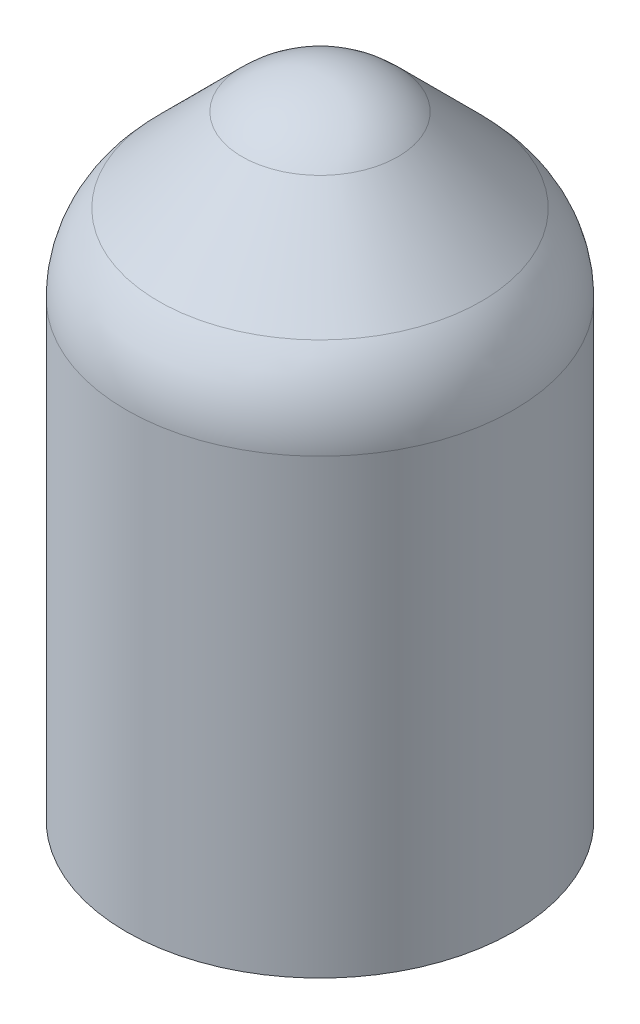
ISO-10303-21;
HEADER;
FILE_DESCRIPTION(('STEP AP214'),'2;1');
FILE_NAME('part.step','',(''),(''),'','','');
FILE_SCHEMA(('AUTOMOTIVE_DESIGN { 1 0 10303 214 1 1 1 1 }'));
ENDSEC;
DATA;
#1=APPLICATION_CONTEXT('core data for automotive mechanical design processes');
#2=APPLICATION_PROTOCOL_DEFINITION('international standard','automotive_design',2000,#1);
#3=PRODUCT_CONTEXT('',#1,'mechanical');
#4=PRODUCT('Part','Part','',(#3));
#5=PRODUCT_RELATED_PRODUCT_CATEGORY('part','',(#4));
#6=PRODUCT_DEFINITION_FORMATION('','',#4);
#7=PRODUCT_DEFINITION_CONTEXT('part definition',#1,'design');
#8=PRODUCT_DEFINITION('design','',#6,#7);
#9=PRODUCT_DEFINITION_SHAPE('','',#8);
#10=(LENGTH_UNIT() NAMED_UNIT(*) SI_UNIT(.MILLI.,.METRE.));
#11=(NAMED_UNIT(*) PLANE_ANGLE_UNIT() SI_UNIT($,.RADIAN.));
#12=(NAMED_UNIT(*) SI_UNIT($,.STERADIAN.) SOLID_ANGLE_UNIT());
#13=UNCERTAINTY_MEASURE_WITH_UNIT(LENGTH_MEASURE(1.E-05),#10,'distance_accuracy_value','');
#14=(GEOMETRIC_REPRESENTATION_CONTEXT(3) GLOBAL_UNCERTAINTY_ASSIGNED_CONTEXT((#13)) GLOBAL_UNIT_ASSIGNED_CONTEXT((#10,
#11,#12)) REPRESENTATION_CONTEXT('',''));
#15=CARTESIAN_POINT('',(0.,0.,0.));
#16=DIRECTION('',(0.,0.,1.));
#17=DIRECTION('',(1.,0.,0.));
#18=AXIS2_PLACEMENT_3D('',#15,#16,#17);
#19=CARTESIAN_POINT('',(60.,0.,0.));
#20=DIRECTION('',(0.,-1.,0.));
#21=DIRECTION('',(0.,0.,-1.));
#22=AXIS2_PLACEMENT_3D('',#19,#20,#21);
#23=PLANE('',#22);
#24=CARTESIAN_POINT('',(0.,0.,0.));
#25=DIRECTION('',(0.,-1.,0.));
#26=DIRECTION('',(0.,0.,-1.));
#27=AXIS2_PLACEMENT_3D('',#24,#25,#26);
#28=CIRCLE('',#27,58.);
#29=CARTESIAN_POINT('',(0.,0.,-58.));
#30=VERTEX_POINT('',#29);
#31=EDGE_CURVE('E50',#30,#30,#28,.T.);
#32=ORIENTED_EDGE('',*,*,#31,.F.);
#33=EDGE_LOOP('',(#32));
#34=FACE_BOUND('',#33,.T.);
#35=CARTESIAN_POINT('',(0.,0.,0.));
#36=DIRECTION('',(0.,-1.,0.));
#37=DIRECTION('',(0.,0.,-1.));
#38=AXIS2_PLACEMENT_3D('',#35,#36,#37);
#39=CIRCLE('',#38,60.);
#40=CARTESIAN_POINT('',(0.,0.,-60.));
#41=VERTEX_POINT('',#40);
#42=EDGE_CURVE('E10',#41,#41,#39,.T.);
#43=ORIENTED_EDGE('',*,*,#42,.T.);
#44=EDGE_LOOP('',(#43));
#45=FACE_BOUND('',#44,.T.);
#46=ADVANCED_FACE('F31',(#34,#45),#23,.T.);
#47=CARTESIAN_POINT('',(0.,0.,0.));
#48=DIRECTION('',(0.,-1.,0.));
#49=DIRECTION('',(0.,0.,-1.));
#50=AXIS2_PLACEMENT_3D('',#47,#48,#49);
#51=CYLINDRICAL_SURFACE('',#50,60.);
#52=CARTESIAN_POINT('',(0.,140.,0.));
#53=DIRECTION('',(0.,-1.,0.));
#54=DIRECTION('',(0.,0.,-1.));
#55=AXIS2_PLACEMENT_3D('',#52,#53,#54);
#56=CIRCLE('',#55,60.);
#57=CARTESIAN_POINT('',(0.,140.,-60.));
#58=VERTEX_POINT('',#57);
#59=EDGE_CURVE('E37',#58,#58,#56,.T.);
#60=ORIENTED_EDGE('',*,*,#59,.T.);
#61=EDGE_LOOP('',(#60));
#62=FACE_BOUND('',#61,.T.);
#63=ORIENTED_EDGE('',*,*,#42,.F.);
#64=EDGE_LOOP('',(#63));
#65=FACE_BOUND('',#64,.T.);
#66=ADVANCED_FACE('F73',(#62,#65),#51,.T.);
#67=CARTESIAN_POINT('',(0.,140.,0.));
#68=DIRECTION('',(0.,-1.,0.));
#69=DIRECTION('',(0.,0.,-1.));
#70=AXIS2_PLACEMENT_3D('',#67,#68,#69);
#71=DEGENERATE_TOROIDAL_SURFACE('',#70,25.8578643762691,34.1421356237309,.T.);
#72=CARTESIAN_POINT('',(0.,164.142135623731,0.));
#73=DIRECTION('',(0.,-1.,0.));
#74=DIRECTION('',(0.,0.,-1.));
#75=AXIS2_PLACEMENT_3D('',#72,#73,#74);
#76=CIRCLE('',#75,50.);
#77=CARTESIAN_POINT('',(0.,164.142135623731,-50.));
#78=VERTEX_POINT('',#77);
#79=EDGE_CURVE('E41',#78,#78,#76,.T.);
#80=ORIENTED_EDGE('',*,*,#79,.T.);
#81=EDGE_LOOP('',(#80));
#82=FACE_BOUND('',#81,.T.);
#83=ORIENTED_EDGE('',*,*,#59,.F.);
#84=EDGE_LOOP('',(#83));
#85=FACE_BOUND('',#84,.T.);
#86=ADVANCED_FACE('F77',(#82,#85),#71,.T.);
#87=CARTESIAN_POINT('',(0.,164.142135623731,0.));
#88=DIRECTION('',(0.,-1.,0.));
#89=DIRECTION('',(0.,0.,-1.));
#90=AXIS2_PLACEMENT_3D('',#87,#88,#89);
#91=CONICAL_SURFACE('',#90,50.,0.785398163397448);
#92=CARTESIAN_POINT('',(0.,190.,0.));
#93=DIRECTION('',(0.,-1.,0.));
#94=DIRECTION('',(0.,0.,-1.));
#95=AXIS2_PLACEMENT_3D('',#92,#93,#94);
#96=CIRCLE('',#95,24.1421356237309);
#97=CARTESIAN_POINT('',(0.,190.,-24.1421356237309));
#98=VERTEX_POINT('',#97);
#99=EDGE_CURVE('E45',#98,#98,#96,.T.);
#100=ORIENTED_EDGE('',*,*,#99,.T.);
#101=EDGE_LOOP('',(#100));
#102=FACE_BOUND('',#101,.T.);
#103=ORIENTED_EDGE('',*,*,#79,.F.);
#104=EDGE_LOOP('',(#103));
#105=FACE_BOUND('',#104,.T.);
#106=ADVANCED_FACE('F81',(#102,#105),#91,.T.);
#107=CARTESIAN_POINT('',(0.,165.857864376269,0.));
#108=DIRECTION('',(0.,-1.,0.));
#109=DIRECTION('',(1.,0.,0.));
#110=AXIS2_PLACEMENT_3D('',#107,#108,#109);
#111=SPHERICAL_SURFACE('',#110,34.1421356237309);
#112=ORIENTED_EDGE('',*,*,#99,.F.);
#113=EDGE_LOOP('',(#112));
#114=FACE_BOUND('',#113,.T.);
#115=ADVANCED_FACE('F68',(#114),#111,.T.);
#116=CARTESIAN_POINT('',(0.,0.,0.));
#117=DIRECTION('',(0.,-1.,0.));
#118=DIRECTION('',(0.,0.,-1.));
#119=AXIS2_PLACEMENT_3D('',#116,#117,#118);
#120=CYLINDRICAL_SURFACE('',#119,58.);
#121=CARTESIAN_POINT('',(0.,140.,0.));
#122=DIRECTION('',(0.,-1.,0.));
#123=DIRECTION('',(0.,0.,-1.));
#124=AXIS2_PLACEMENT_3D('',#121,#122,#123);
#125=CIRCLE('',#124,58.);
#126=CARTESIAN_POINT('',(0.,140.,-58.));
#127=VERTEX_POINT('',#126);
#128=EDGE_CURVE('E53',#127,#127,#125,.T.);
#129=ORIENTED_EDGE('',*,*,#128,.F.);
#130=EDGE_LOOP('',(#129));
#131=FACE_BOUND('',#130,.T.);
#132=ORIENTED_EDGE('',*,*,#31,.T.);
#133=EDGE_LOOP('',(#132));
#134=FACE_BOUND('',#133,.T.);
#135=ADVANCED_FACE('F65',(#131,#134),#120,.F.);
#136=CARTESIAN_POINT('',(0.,140.,0.));
#137=DIRECTION('',(0.,-1.,0.));
#138=DIRECTION('',(0.,0.,-1.));
#139=AXIS2_PLACEMENT_3D('',#136,#137,#138);
#140=DEGENERATE_TOROIDAL_SURFACE('',#139,25.8578643762691,32.1421356237309,.T.);
#141=CARTESIAN_POINT('',(0.,162.727922061358,0.));
#142=DIRECTION('',(0.,-1.,0.));
#143=DIRECTION('',(0.,0.,-1.));
#144=AXIS2_PLACEMENT_3D('',#141,#142,#143);
#145=CIRCLE('',#144,48.5857864376269);
#146=CARTESIAN_POINT('',(0.,162.727922061358,-48.5857864376269));
#147=VERTEX_POINT('',#146);
#148=EDGE_CURVE('E57',#147,#147,#145,.T.);
#149=ORIENTED_EDGE('',*,*,#148,.F.);
#150=EDGE_LOOP('',(#149));
#151=FACE_BOUND('',#150,.T.);
#152=ORIENTED_EDGE('',*,*,#128,.T.);
#153=EDGE_LOOP('',(#152));
#154=FACE_BOUND('',#153,.T.);
#155=ADVANCED_FACE('F63',(#151,#154),#140,.F.);
#156=CARTESIAN_POINT('',(0.,162.727922061358,0.));
#157=DIRECTION('',(0.,-1.,0.));
#158=DIRECTION('',(0.,0.,-1.));
#159=AXIS2_PLACEMENT_3D('',#156,#157,#158);
#160=CONICAL_SURFACE('',#159,48.5857864376269,0.785398163397448);
#161=CARTESIAN_POINT('',(0.,188.585786437627,0.));
#162=DIRECTION('',(0.,-1.,0.));
#163=DIRECTION('',(0.,0.,-1.));
#164=AXIS2_PLACEMENT_3D('',#161,#162,#163);
#165=CIRCLE('',#164,22.7279220613579);
#166=CARTESIAN_POINT('',(0.,188.585786437627,-22.7279220613579));
#167=VERTEX_POINT('',#166);
#168=EDGE_CURVE('E54',#167,#167,#165,.T.);
#169=ORIENTED_EDGE('',*,*,#168,.F.);
#170=EDGE_LOOP('',(#169));
#171=FACE_BOUND('',#170,.T.);
#172=ORIENTED_EDGE('',*,*,#148,.T.);
#173=EDGE_LOOP('',(#172));
#174=FACE_BOUND('',#173,.T.);
#175=ADVANCED_FACE('F95',(#171,#174),#160,.F.);
#176=CARTESIAN_POINT('',(0.,165.857864376269,0.));
#177=DIRECTION('',(0.,-1.,0.));
#178=DIRECTION('',(1.,0.,0.));
#179=AXIS2_PLACEMENT_3D('',#176,#177,#178);
#180=SPHERICAL_SURFACE('',#179,32.1421356237309);
#181=ORIENTED_EDGE('',*,*,#168,.T.);
#182=EDGE_LOOP('',(#181));
#183=FACE_BOUND('',#182,.T.);
#184=ADVANCED_FACE('F92',(#183),#180,.F.);
#185=CLOSED_SHELL('',(#46,#66,#86,#106,#115,#135,#155,#175,#184));
#186=MANIFOLD_SOLID_BREP('B2',#185);
#187=ADVANCED_BREP_SHAPE_REPRESENTATION('',(#18,#186),#14);
#188=SHAPE_DEFINITION_REPRESENTATION(#9,#187);
ENDSEC;
END-ISO-10303-21;
